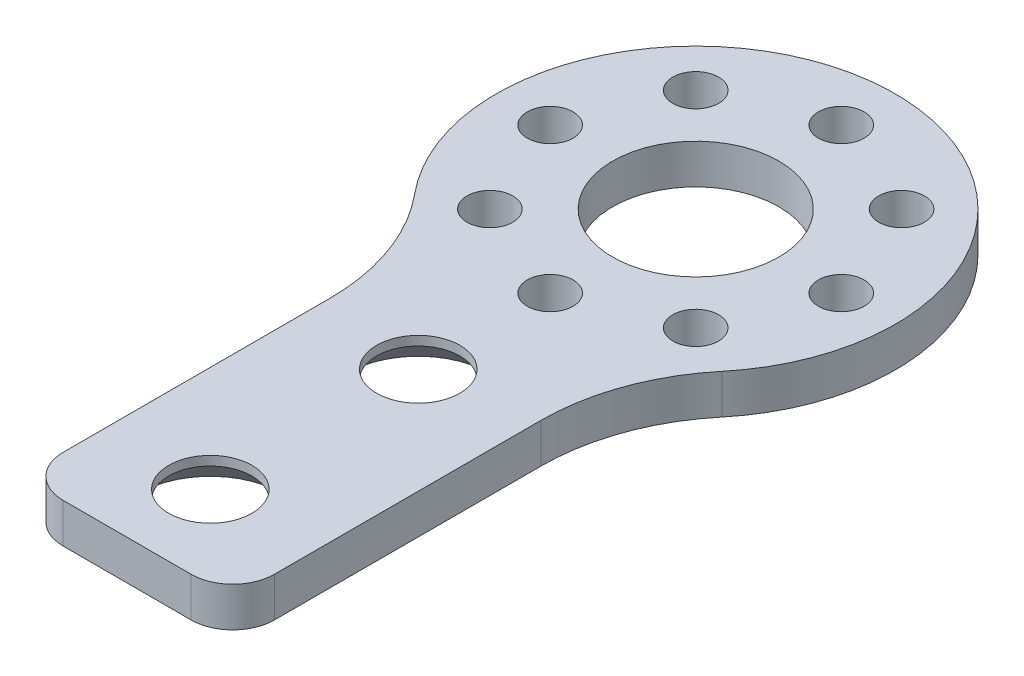
ISO-10303-21;
HEADER;
FILE_DESCRIPTION(('STEP AP214'),'2;1');
FILE_NAME('part.step','',(''),(''),'','','');
FILE_SCHEMA(('AUTOMOTIVE_DESIGN { 1 0 10303 214 1 1 1 1 }'));
ENDSEC;
DATA;
#1=APPLICATION_CONTEXT('core data for automotive mechanical design processes');
#2=APPLICATION_PROTOCOL_DEFINITION('international standard','automotive_design',2000,#1);
#3=PRODUCT_CONTEXT('',#1,'mechanical');
#4=PRODUCT('Part','Part','',(#3));
#5=PRODUCT_RELATED_PRODUCT_CATEGORY('part','',(#4));
#6=PRODUCT_DEFINITION_FORMATION('','',#4);
#7=PRODUCT_DEFINITION_CONTEXT('part definition',#1,'design');
#8=PRODUCT_DEFINITION('design','',#6,#7);
#9=PRODUCT_DEFINITION_SHAPE('','',#8);
#10=(LENGTH_UNIT() NAMED_UNIT(*) SI_UNIT(.MILLI.,.METRE.));
#11=(NAMED_UNIT(*) PLANE_ANGLE_UNIT() SI_UNIT($,.RADIAN.));
#12=(NAMED_UNIT(*) SI_UNIT($,.STERADIAN.) SOLID_ANGLE_UNIT());
#13=UNCERTAINTY_MEASURE_WITH_UNIT(LENGTH_MEASURE(1.E-05),#10,'distance_accuracy_value','');
#14=(GEOMETRIC_REPRESENTATION_CONTEXT(3) GLOBAL_UNCERTAINTY_ASSIGNED_CONTEXT((#13)) GLOBAL_UNIT_ASSIGNED_CONTEXT((#10,
#11,#12)) REPRESENTATION_CONTEXT('',''));
#15=CARTESIAN_POINT('',(0.,0.,0.));
#16=DIRECTION('',(0.,0.,1.));
#17=DIRECTION('',(1.,0.,0.));
#18=AXIS2_PLACEMENT_3D('',#15,#16,#17);
#19=CARTESIAN_POINT('',(0.,0.,0.));
#20=DIRECTION('',(0.,1.,0.));
#21=DIRECTION('',(0.,0.,1.));
#22=AXIS2_PLACEMENT_3D('',#19,#20,#21);
#23=PLANE('',#22);
#24=CARTESIAN_POINT('',(0.,0.,33.3644297735046));
#25=DIRECTION('',(0.,-1.,0.));
#26=DIRECTION('',(0.,0.,-1.));
#27=AXIS2_PLACEMENT_3D('',#24,#25,#26);
#28=CIRCLE('',#27,8.65);
#29=CARTESIAN_POINT('',(0.,0.,24.7144297735046));
#30=VERTEX_POINT('',#29);
#31=EDGE_CURVE('E327',#30,#30,#28,.T.);
#32=ORIENTED_EDGE('',*,*,#31,.F.);
#33=EDGE_LOOP('',(#32));
#34=FACE_BOUND('',#33,.T.);
#35=CARTESIAN_POINT('',(0.,0.,0.));
#36=DIRECTION('',(0.,-1.,0.));
#37=DIRECTION('',(0.,0.,-1.));
#38=AXIS2_PLACEMENT_3D('',#35,#36,#37);
#39=CIRCLE('',#38,10.);
#40=CARTESIAN_POINT('',(0.,0.,-10.));
#41=VERTEX_POINT('',#40);
#42=EDGE_CURVE('E303',#41,#41,#39,.T.);
#43=ORIENTED_EDGE('',*,*,#42,.F.);
#44=EDGE_LOOP('',(#43));
#45=FACE_BOUND('',#44,.T.);
#46=CARTESIAN_POINT('',(0.,0.,-17.5));
#47=DIRECTION('',(0.,-1.,0.));
#48=DIRECTION('',(0.,0.,-1.));
#49=AXIS2_PLACEMENT_3D('',#46,#47,#48);
#50=CIRCLE('',#49,2.775);
#51=CARTESIAN_POINT('',(0.,0.,-20.275));
#52=VERTEX_POINT('',#51);
#53=EDGE_CURVE('E295',#52,#52,#50,.T.);
#54=ORIENTED_EDGE('',*,*,#53,.F.);
#55=EDGE_LOOP('',(#54));
#56=FACE_BOUND('',#55,.T.);
#57=CARTESIAN_POINT('',(-12.3743686707646,0.,-12.3743686707646));
#58=DIRECTION('',(0.,-1.,0.));
#59=DIRECTION('',(0.,0.,-1.));
#60=AXIS2_PLACEMENT_3D('',#57,#58,#59);
#61=CIRCLE('',#60,2.775);
#62=CARTESIAN_POINT('',(-12.3743686707646,0.,-15.1493686707646));
#63=VERTEX_POINT('',#62);
#64=EDGE_CURVE('E283',#63,#63,#61,.T.);
#65=ORIENTED_EDGE('',*,*,#64,.F.);
#66=EDGE_LOOP('',(#65));
#67=FACE_BOUND('',#66,.T.);
#68=CARTESIAN_POINT('',(-17.5,0.,0.));
#69=DIRECTION('',(0.,-1.,0.));
#70=DIRECTION('',(0.,0.,-1.));
#71=AXIS2_PLACEMENT_3D('',#68,#69,#70);
#72=CIRCLE('',#71,2.775);
#73=CARTESIAN_POINT('',(-17.5,0.,-2.775));
#74=VERTEX_POINT('',#73);
#75=EDGE_CURVE('E271',#74,#74,#72,.T.);
#76=ORIENTED_EDGE('',*,*,#75,.F.);
#77=EDGE_LOOP('',(#76));
#78=FACE_BOUND('',#77,.T.);
#79=CARTESIAN_POINT('',(-12.3743686707646,0.,12.3743686707646));
#80=DIRECTION('',(0.,-1.,0.));
#81=DIRECTION('',(0.,0.,-1.));
#82=AXIS2_PLACEMENT_3D('',#79,#80,#81);
#83=CIRCLE('',#82,2.775);
#84=CARTESIAN_POINT('',(-12.3743686707646,0.,9.59936867076458));
#85=VERTEX_POINT('',#84);
#86=EDGE_CURVE('E259',#85,#85,#83,.T.);
#87=ORIENTED_EDGE('',*,*,#86,.F.);
#88=EDGE_LOOP('',(#87));
#89=FACE_BOUND('',#88,.T.);
#90=CARTESIAN_POINT('',(0.,0.,17.5));
#91=DIRECTION('',(0.,-1.,0.));
#92=DIRECTION('',(0.,0.,-1.));
#93=AXIS2_PLACEMENT_3D('',#90,#91,#92);
#94=CIRCLE('',#93,2.775);
#95=CARTESIAN_POINT('',(0.,0.,14.725));
#96=VERTEX_POINT('',#95);
#97=EDGE_CURVE('E247',#96,#96,#94,.T.);
#98=ORIENTED_EDGE('',*,*,#97,.F.);
#99=EDGE_LOOP('',(#98));
#100=FACE_BOUND('',#99,.T.);
#101=CARTESIAN_POINT('',(12.3743686707646,0.,12.3743686707646));
#102=DIRECTION('',(0.,-1.,0.));
#103=DIRECTION('',(0.,0.,-1.));
#104=AXIS2_PLACEMENT_3D('',#101,#102,#103);
#105=CIRCLE('',#104,2.775);
#106=CARTESIAN_POINT('',(12.3743686707646,0.,9.59936867076458));
#107=VERTEX_POINT('',#106);
#108=EDGE_CURVE('E235',#107,#107,#105,.T.);
#109=ORIENTED_EDGE('',*,*,#108,.F.);
#110=EDGE_LOOP('',(#109));
#111=FACE_BOUND('',#110,.T.);
#112=CARTESIAN_POINT('',(17.5,0.,0.));
#113=DIRECTION('',(0.,-1.,0.));
#114=DIRECTION('',(0.,0.,-1.));
#115=AXIS2_PLACEMENT_3D('',#112,#113,#114);
#116=CIRCLE('',#115,2.775);
#117=CARTESIAN_POINT('',(17.5,0.,-2.775));
#118=VERTEX_POINT('',#117);
#119=EDGE_CURVE('E223',#118,#118,#116,.T.);
#120=ORIENTED_EDGE('',*,*,#119,.F.);
#121=EDGE_LOOP('',(#120));
#122=FACE_BOUND('',#121,.T.);
#123=CARTESIAN_POINT('',(12.3743686707646,0.,-12.3743686707646));
#124=DIRECTION('',(0.,-1.,0.));
#125=DIRECTION('',(0.,0.,-1.));
#126=AXIS2_PLACEMENT_3D('',#123,#124,#125);
#127=CIRCLE('',#126,2.775);
#128=CARTESIAN_POINT('',(12.3743686707646,0.,-15.1493686707646));
#129=VERTEX_POINT('',#128);
#130=EDGE_CURVE('E211',#129,#129,#127,.T.);
#131=ORIENTED_EDGE('',*,*,#130,.F.);
#132=EDGE_LOOP('',(#131));
#133=FACE_BOUND('',#132,.T.);
#134=DIRECTION('',(0.,0.,-1.));
#135=VECTOR('',#134,1.);
#136=CARTESIAN_POINT('',(12.7,0.,68.3644297735046));
#137=LINE('',#136,#135);
#138=CARTESIAN_POINT('',(12.7,0.,63.3644297735046));
#139=VERTEX_POINT('',#138);
#140=CARTESIAN_POINT('',(12.7,0.,31.3003194871874));
#141=VERTEX_POINT('',#140);
#142=EDGE_CURVE('E194',#139,#141,#137,.T.);
#143=ORIENTED_EDGE('',*,*,#142,.F.);
#144=CARTESIAN_POINT('',(7.7,0.,63.3644297735046));
#145=DIRECTION('',(0.,1.,0.));
#146=DIRECTION('',(0.,0.,1.));
#147=AXIS2_PLACEMENT_3D('',#144,#145,#146);
#148=CIRCLE('',#147,5.);
#149=CARTESIAN_POINT('',(7.7,0.,68.3644297735046));
#150=VERTEX_POINT('',#149);
#151=EDGE_CURVE('E167',#139,#150,#148,.F.);
#152=ORIENTED_EDGE('',*,*,#151,.T.);
#153=DIRECTION('',(1.,0.,0.));
#154=VECTOR('',#153,1.);
#155=CARTESIAN_POINT('',(-12.7,0.,68.3644297735046));
#156=LINE('',#155,#154);
#157=CARTESIAN_POINT('',(-7.7,0.,68.3644297735046));
#158=VERTEX_POINT('',#157);
#159=EDGE_CURVE('E119',#158,#150,#156,.T.);
#160=ORIENTED_EDGE('',*,*,#159,.F.);
#161=CARTESIAN_POINT('',(-7.7,0.,63.3644297735046));
#162=DIRECTION('',(0.,1.,0.));
#163=DIRECTION('',(0.,0.,1.));
#164=AXIS2_PLACEMENT_3D('',#161,#162,#163);
#165=CIRCLE('',#164,5.);
#166=CARTESIAN_POINT('',(-12.7,0.,63.3644297735046));
#167=VERTEX_POINT('',#166);
#168=EDGE_CURVE('E116',#158,#167,#165,.F.);
#169=ORIENTED_EDGE('',*,*,#168,.T.);
#170=DIRECTION('',(0.,0.,-1.));
#171=VECTOR('',#170,1.);
#172=CARTESIAN_POINT('',(-12.7,0.,68.3644297735046));
#173=LINE('',#172,#171);
#174=CARTESIAN_POINT('',(-12.7,0.,31.3003194871874));
#175=VERTEX_POINT('',#174);
#176=EDGE_CURVE('E108',#167,#175,#173,.T.);
#177=ORIENTED_EDGE('',*,*,#176,.T.);
#178=CARTESIAN_POINT('',(-37.7,0.,31.3003194871874));
#179=DIRECTION('',(0.,1.,0.));
#180=DIRECTION('',(0.,0.,1.));
#181=AXIS2_PLACEMENT_3D('',#178,#179,#180);
#182=CIRCLE('',#181,25.);
#183=CARTESIAN_POINT('',(-18.465306122449,0.,15.3307687284183));
#184=VERTEX_POINT('',#183);
#185=EDGE_CURVE('E113',#175,#184,#182,.T.);
#186=ORIENTED_EDGE('',*,*,#185,.T.);
#187=CARTESIAN_POINT('',(0.,0.,0.));
#188=DIRECTION('',(0.,1.,0.));
#189=DIRECTION('',(0.,0.,1.));
#190=AXIS2_PLACEMENT_3D('',#187,#188,#189);
#191=CIRCLE('',#190,24.);
#192=CARTESIAN_POINT('',(18.465306122449,0.,15.3307687284183));
#193=VERTEX_POINT('',#192);
#194=EDGE_CURVE('E120',#193,#184,#191,.T.);
#195=ORIENTED_EDGE('',*,*,#194,.F.);
#196=CARTESIAN_POINT('',(37.7,0.,31.3003194871874));
#197=DIRECTION('',(0.,1.,0.));
#198=DIRECTION('',(0.,0.,1.));
#199=AXIS2_PLACEMENT_3D('',#196,#197,#198);
#200=CIRCLE('',#199,25.);
#201=EDGE_CURVE('E154',#193,#141,#200,.T.);
#202=ORIENTED_EDGE('',*,*,#201,.T.);
#203=EDGE_LOOP('',(#143,#152,#160,#169,#177,#186,#195,#202));
#204=FACE_BOUND('',#203,.T.);
#205=CARTESIAN_POINT('',(0.,0.,58.3644297735046));
#206=DIRECTION('',(0.,-1.,0.));
#207=DIRECTION('',(0.,0.,-1.));
#208=AXIS2_PLACEMENT_3D('',#205,#206,#207);
#209=CIRCLE('',#208,8.65);
#210=CARTESIAN_POINT('',(0.,0.,49.7144297735046));
#211=VERTEX_POINT('',#210);
#212=EDGE_CURVE('E315',#211,#211,#209,.T.);
#213=ORIENTED_EDGE('',*,*,#212,.F.);
#214=EDGE_LOOP('',(#213));
#215=FACE_BOUND('',#214,.T.);
#216=ADVANCED_FACE('F43',(#34,#45,#56,#67,#78,#89,#100,#111,#122,#133,#204,#215),#23,.F.);
#217=CARTESIAN_POINT('',(12.7,4.7625,68.3644297735046));
#218=DIRECTION('',(-1.,0.,0.));
#219=DIRECTION('',(0.,0.,1.));
#220=AXIS2_PLACEMENT_3D('',#217,#218,#219);
#221=PLANE('',#220);
#222=DIRECTION('',(0.,0.,-1.));
#223=VECTOR('',#222,1.);
#224=CARTESIAN_POINT('',(12.7,4.7625,68.3644297735046));
#225=LINE('',#224,#223);
#226=CARTESIAN_POINT('',(12.7,4.7625,63.3644297735046));
#227=VERTEX_POINT('',#226);
#228=CARTESIAN_POINT('',(12.7,4.7625,31.3003194871874));
#229=VERTEX_POINT('',#228);
#230=EDGE_CURVE('E183',#227,#229,#225,.T.);
#231=ORIENTED_EDGE('',*,*,#230,.F.);
#232=DIRECTION('',(0.,-1.,0.));
#233=VECTOR('',#232,1.);
#234=CARTESIAN_POINT('',(12.7,4.7625,63.3644297735046));
#235=LINE('',#234,#233);
#236=EDGE_CURVE('E161',#227,#139,#235,.T.);
#237=ORIENTED_EDGE('',*,*,#236,.T.);
#238=ORIENTED_EDGE('',*,*,#142,.T.);
#239=DIRECTION('',(0.,1.,0.));
#240=VECTOR('',#239,1.);
#241=CARTESIAN_POINT('',(12.7,4.7625,31.3003194871874));
#242=LINE('',#241,#240);
#243=EDGE_CURVE('E131',#141,#229,#242,.T.);
#244=ORIENTED_EDGE('',*,*,#243,.T.);
#245=EDGE_LOOP('',(#231,#237,#238,#244));
#246=FACE_BOUND('',#245,.T.);
#247=ADVANCED_FACE('F187',(#246),#221,.F.);
#248=CARTESIAN_POINT('',(0.,4.7625,0.));
#249=DIRECTION('',(0.,-1.,0.));
#250=DIRECTION('',(0.,0.,-1.));
#251=AXIS2_PLACEMENT_3D('',#248,#249,#250);
#252=CYLINDRICAL_SURFACE('',#251,24.);
#253=ORIENTED_EDGE('',*,*,#194,.T.);
#254=DIRECTION('',(0.,-1.,0.));
#255=VECTOR('',#254,1.);
#256=CARTESIAN_POINT('',(-18.465306122449,4.7625,15.3307687284183));
#257=LINE('',#256,#255);
#258=CARTESIAN_POINT('',(-18.465306122449,4.7625,15.3307687284183));
#259=VERTEX_POINT('',#258);
#260=EDGE_CURVE('E128',#184,#259,#257,.F.);
#261=ORIENTED_EDGE('',*,*,#260,.T.);
#262=CARTESIAN_POINT('',(0.,4.7625,0.));
#263=DIRECTION('',(0.,1.,0.));
#264=DIRECTION('',(0.,0.,1.));
#265=AXIS2_PLACEMENT_3D('',#262,#263,#264);
#266=CIRCLE('',#265,24.);
#267=CARTESIAN_POINT('',(18.465306122449,4.7625,15.3307687284183));
#268=VERTEX_POINT('',#267);
#269=EDGE_CURVE('E191',#268,#259,#266,.T.);
#270=ORIENTED_EDGE('',*,*,#269,.F.);
#271=DIRECTION('',(0.,-1.,0.));
#272=VECTOR('',#271,1.);
#273=CARTESIAN_POINT('',(18.465306122449,4.7625,15.3307687284183));
#274=LINE('',#273,#272);
#275=EDGE_CURVE('E137',#268,#193,#274,.T.);
#276=ORIENTED_EDGE('',*,*,#275,.T.);
#277=EDGE_LOOP('',(#253,#261,#270,#276));
#278=FACE_BOUND('',#277,.T.);
#279=ADVANCED_FACE('F340',(#278),#252,.T.);
#280=CARTESIAN_POINT('',(-12.7,4.7625,68.3644297735046));
#281=DIRECTION('',(-1.,0.,0.));
#282=DIRECTION('',(0.,0.,1.));
#283=AXIS2_PLACEMENT_3D('',#280,#281,#282);
#284=PLANE('',#283);
#285=ORIENTED_EDGE('',*,*,#176,.F.);
#286=DIRECTION('',(0.,-1.,0.));
#287=VECTOR('',#286,1.);
#288=CARTESIAN_POINT('',(-12.7,4.7625,63.3644297735046));
#289=LINE('',#288,#287);
#290=CARTESIAN_POINT('',(-12.7,4.7625,63.3644297735046));
#291=VERTEX_POINT('',#290);
#292=EDGE_CURVE('E11',#167,#291,#289,.F.);
#293=ORIENTED_EDGE('',*,*,#292,.T.);
#294=DIRECTION('',(0.,0.,-1.));
#295=VECTOR('',#294,1.);
#296=CARTESIAN_POINT('',(-12.7,4.7625,68.3644297735046));
#297=LINE('',#296,#295);
#298=CARTESIAN_POINT('',(-12.7,4.7625,31.3003194871874));
#299=VERTEX_POINT('',#298);
#300=EDGE_CURVE('E134',#291,#299,#297,.T.);
#301=ORIENTED_EDGE('',*,*,#300,.T.);
#302=DIRECTION('',(0.,-1.,0.));
#303=VECTOR('',#302,1.);
#304=CARTESIAN_POINT('',(-12.7,4.7625,31.3003194871874));
#305=LINE('',#304,#303);
#306=EDGE_CURVE('E127',#299,#175,#305,.T.);
#307=ORIENTED_EDGE('',*,*,#306,.T.);
#308=EDGE_LOOP('',(#285,#293,#301,#307));
#309=FACE_BOUND('',#308,.T.);
#310=ADVANCED_FACE('F133',(#309),#284,.T.);
#311=CARTESIAN_POINT('',(-12.7,4.7625,68.3644297735046));
#312=DIRECTION('',(0.,0.,-1.));
#313=DIRECTION('',(-1.,0.,0.));
#314=AXIS2_PLACEMENT_3D('',#311,#312,#313);
#315=PLANE('',#314);
#316=ORIENTED_EDGE('',*,*,#159,.T.);
#317=DIRECTION('',(0.,-1.,0.));
#318=VECTOR('',#317,1.);
#319=CARTESIAN_POINT('',(7.7,4.7625,68.3644297735046));
#320=LINE('',#319,#318);
#321=CARTESIAN_POINT('',(7.7,4.7625,68.3644297735046));
#322=VERTEX_POINT('',#321);
#323=EDGE_CURVE('E65',#150,#322,#320,.F.);
#324=ORIENTED_EDGE('',*,*,#323,.T.);
#325=DIRECTION('',(1.,0.,0.));
#326=VECTOR('',#325,1.);
#327=CARTESIAN_POINT('',(-12.7,4.7625,68.3644297735046));
#328=LINE('',#327,#326);
#329=CARTESIAN_POINT('',(-7.7,4.7625,68.3644297735046));
#330=VERTEX_POINT('',#329);
#331=EDGE_CURVE('E138',#330,#322,#328,.T.);
#332=ORIENTED_EDGE('',*,*,#331,.F.);
#333=DIRECTION('',(0.,-1.,0.));
#334=VECTOR('',#333,1.);
#335=CARTESIAN_POINT('',(-7.7,0.,68.3644297735046));
#336=LINE('',#335,#334);
#337=EDGE_CURVE('E170',#330,#158,#336,.T.);
#338=ORIENTED_EDGE('',*,*,#337,.T.);
#339=EDGE_LOOP('',(#316,#324,#332,#338));
#340=FACE_BOUND('',#339,.T.);
#341=ADVANCED_FACE('F195',(#340),#315,.F.);
#342=CARTESIAN_POINT('',(0.,4.7625,0.));
#343=DIRECTION('',(0.,1.,0.));
#344=DIRECTION('',(0.,0.,1.));
#345=AXIS2_PLACEMENT_3D('',#342,#343,#344);
#346=PLANE('',#345);
#347=CARTESIAN_POINT('',(0.,4.7625,33.3644297735046));
#348=DIRECTION('',(0.,-1.,0.));
#349=DIRECTION('',(0.,0.,-1.));
#350=AXIS2_PLACEMENT_3D('',#347,#348,#349);
#351=CIRCLE('',#350,5.);
#352=CARTESIAN_POINT('',(0.,4.7625,28.3644297735046));
#353=VERTEX_POINT('',#352);
#354=EDGE_CURVE('E319',#353,#353,#351,.T.);
#355=ORIENTED_EDGE('',*,*,#354,.T.);
#356=EDGE_LOOP('',(#355));
#357=FACE_BOUND('',#356,.T.);
#358=CARTESIAN_POINT('',(0.,4.7625,58.3644297735046));
#359=DIRECTION('',(0.,-1.,0.));
#360=DIRECTION('',(0.,0.,-1.));
#361=AXIS2_PLACEMENT_3D('',#358,#359,#360);
#362=CIRCLE('',#361,5.);
#363=CARTESIAN_POINT('',(0.,4.7625,53.3644297735046));
#364=VERTEX_POINT('',#363);
#365=EDGE_CURVE('E307',#364,#364,#362,.T.);
#366=ORIENTED_EDGE('',*,*,#365,.T.);
#367=EDGE_LOOP('',(#366));
#368=FACE_BOUND('',#367,.T.);
#369=CARTESIAN_POINT('',(0.,4.7625,0.));
#370=DIRECTION('',(0.,-1.,0.));
#371=DIRECTION('',(0.,0.,-1.));
#372=AXIS2_PLACEMENT_3D('',#369,#370,#371);
#373=CIRCLE('',#372,10.);
#374=CARTESIAN_POINT('',(0.,4.7625,-10.));
#375=VERTEX_POINT('',#374);
#376=EDGE_CURVE('E299',#375,#375,#373,.T.);
#377=ORIENTED_EDGE('',*,*,#376,.T.);
#378=EDGE_LOOP('',(#377));
#379=FACE_BOUND('',#378,.T.);
#380=CARTESIAN_POINT('',(0.,4.7625,-17.5));
#381=DIRECTION('',(0.,-1.,0.));
#382=DIRECTION('',(0.,0.,-1.));
#383=AXIS2_PLACEMENT_3D('',#380,#381,#382);
#384=CIRCLE('',#383,2.75);
#385=CARTESIAN_POINT('',(0.,4.7625,-20.25));
#386=VERTEX_POINT('',#385);
#387=EDGE_CURVE('E287',#386,#386,#384,.T.);
#388=ORIENTED_EDGE('',*,*,#387,.T.);
#389=EDGE_LOOP('',(#388));
#390=FACE_BOUND('',#389,.T.);
#391=CARTESIAN_POINT('',(-12.3743686707646,4.7625,-12.3743686707646));
#392=DIRECTION('',(0.,-1.,0.));
#393=DIRECTION('',(0.,0.,-1.));
#394=AXIS2_PLACEMENT_3D('',#391,#392,#393);
#395=CIRCLE('',#394,2.75);
#396=CARTESIAN_POINT('',(-12.3743686707646,4.7625,-15.1243686707646));
#397=VERTEX_POINT('',#396);
#398=EDGE_CURVE('E275',#397,#397,#395,.T.);
#399=ORIENTED_EDGE('',*,*,#398,.T.);
#400=EDGE_LOOP('',(#399));
#401=FACE_BOUND('',#400,.T.);
#402=CARTESIAN_POINT('',(-17.5,4.7625,0.));
#403=DIRECTION('',(0.,-1.,0.));
#404=DIRECTION('',(0.,0.,-1.));
#405=AXIS2_PLACEMENT_3D('',#402,#403,#404);
#406=CIRCLE('',#405,2.75);
#407=CARTESIAN_POINT('',(-17.5,4.7625,-2.75));
#408=VERTEX_POINT('',#407);
#409=EDGE_CURVE('E263',#408,#408,#406,.T.);
#410=ORIENTED_EDGE('',*,*,#409,.T.);
#411=EDGE_LOOP('',(#410));
#412=FACE_BOUND('',#411,.T.);
#413=CARTESIAN_POINT('',(-12.3743686707646,4.7625,12.3743686707646));
#414=DIRECTION('',(0.,-1.,0.));
#415=DIRECTION('',(0.,0.,-1.));
#416=AXIS2_PLACEMENT_3D('',#413,#414,#415);
#417=CIRCLE('',#416,2.75);
#418=CARTESIAN_POINT('',(-12.3743686707646,4.7625,9.62436867076458));
#419=VERTEX_POINT('',#418);
#420=EDGE_CURVE('E251',#419,#419,#417,.T.);
#421=ORIENTED_EDGE('',*,*,#420,.T.);
#422=EDGE_LOOP('',(#421));
#423=FACE_BOUND('',#422,.T.);
#424=CARTESIAN_POINT('',(0.,4.7625,17.5));
#425=DIRECTION('',(0.,-1.,0.));
#426=DIRECTION('',(0.,0.,-1.));
#427=AXIS2_PLACEMENT_3D('',#424,#425,#426);
#428=CIRCLE('',#427,2.75);
#429=CARTESIAN_POINT('',(0.,4.7625,14.75));
#430=VERTEX_POINT('',#429);
#431=EDGE_CURVE('E239',#430,#430,#428,.T.);
#432=ORIENTED_EDGE('',*,*,#431,.T.);
#433=EDGE_LOOP('',(#432));
#434=FACE_BOUND('',#433,.T.);
#435=CARTESIAN_POINT('',(12.3743686707646,4.7625,12.3743686707646));
#436=DIRECTION('',(0.,-1.,0.));
#437=DIRECTION('',(0.,0.,-1.));
#438=AXIS2_PLACEMENT_3D('',#435,#436,#437);
#439=CIRCLE('',#438,2.75);
#440=CARTESIAN_POINT('',(12.3743686707646,4.7625,9.62436867076458));
#441=VERTEX_POINT('',#440);
#442=EDGE_CURVE('E227',#441,#441,#439,.T.);
#443=ORIENTED_EDGE('',*,*,#442,.T.);
#444=EDGE_LOOP('',(#443));
#445=FACE_BOUND('',#444,.T.);
#446=CARTESIAN_POINT('',(17.5,4.7625,0.));
#447=DIRECTION('',(0.,-1.,0.));
#448=DIRECTION('',(0.,0.,-1.));
#449=AXIS2_PLACEMENT_3D('',#446,#447,#448);
#450=CIRCLE('',#449,2.75);
#451=CARTESIAN_POINT('',(17.5,4.7625,-2.75));
#452=VERTEX_POINT('',#451);
#453=EDGE_CURVE('E215',#452,#452,#450,.T.);
#454=ORIENTED_EDGE('',*,*,#453,.T.);
#455=EDGE_LOOP('',(#454));
#456=FACE_BOUND('',#455,.T.);
#457=CARTESIAN_POINT('',(12.3743686707646,4.7625,-12.3743686707646));
#458=DIRECTION('',(0.,-1.,0.));
#459=DIRECTION('',(0.,0.,-1.));
#460=AXIS2_PLACEMENT_3D('',#457,#458,#459);
#461=CIRCLE('',#460,2.75);
#462=CARTESIAN_POINT('',(12.3743686707646,4.7625,-15.1243686707646));
#463=VERTEX_POINT('',#462);
#464=EDGE_CURVE('E203',#463,#463,#461,.T.);
#465=ORIENTED_EDGE('',*,*,#464,.T.);
#466=EDGE_LOOP('',(#465));
#467=FACE_BOUND('',#466,.T.);
#468=ORIENTED_EDGE('',*,*,#331,.T.);
#469=CARTESIAN_POINT('',(7.7,4.7625,63.3644297735046));
#470=DIRECTION('',(0.,1.,0.));
#471=DIRECTION('',(0.,0.,1.));
#472=AXIS2_PLACEMENT_3D('',#469,#470,#471);
#473=CIRCLE('',#472,5.);
#474=EDGE_CURVE('E52',#322,#227,#473,.T.);
#475=ORIENTED_EDGE('',*,*,#474,.T.);
#476=ORIENTED_EDGE('',*,*,#230,.T.);
#477=CARTESIAN_POINT('',(37.7,4.7625,31.3003194871874));
#478=DIRECTION('',(0.,1.,0.));
#479=DIRECTION('',(0.,0.,1.));
#480=AXIS2_PLACEMENT_3D('',#477,#478,#479);
#481=CIRCLE('',#480,25.);
#482=EDGE_CURVE('E158',#229,#268,#481,.F.);
#483=ORIENTED_EDGE('',*,*,#482,.T.);
#484=ORIENTED_EDGE('',*,*,#269,.T.);
#485=CARTESIAN_POINT('',(-37.7,4.7625,31.3003194871874));
#486=DIRECTION('',(0.,1.,0.));
#487=DIRECTION('',(0.,0.,1.));
#488=AXIS2_PLACEMENT_3D('',#485,#486,#487);
#489=CIRCLE('',#488,25.);
#490=EDGE_CURVE('E130',#259,#299,#489,.F.);
#491=ORIENTED_EDGE('',*,*,#490,.T.);
#492=ORIENTED_EDGE('',*,*,#300,.F.);
#493=CARTESIAN_POINT('',(-7.7,4.7625,63.3644297735046));
#494=DIRECTION('',(0.,1.,0.));
#495=DIRECTION('',(0.,0.,1.));
#496=AXIS2_PLACEMENT_3D('',#493,#494,#495);
#497=CIRCLE('',#496,5.);
#498=EDGE_CURVE('E176',#291,#330,#497,.T.);
#499=ORIENTED_EDGE('',*,*,#498,.T.);
#500=EDGE_LOOP('',(#468,#475,#476,#483,#484,#491,#492,#499));
#501=FACE_BOUND('',#500,.T.);
#502=ADVANCED_FACE('F182',(#357,#368,#379,#390,#401,#412,#423,#434,#445,#456,#467,#501),#346,.T.);
#503=CARTESIAN_POINT('',(12.3743686707646,0.,-12.3743686707646));
#504=DIRECTION('',(0.,-1.,0.));
#505=DIRECTION('',(0.,0.,-1.));
#506=AXIS2_PLACEMENT_3D('',#503,#504,#505);
#507=CYLINDRICAL_SURFACE('',#506,2.75);
#508=ORIENTED_EDGE('',*,*,#464,.F.);
#509=EDGE_LOOP('',(#508));
#510=FACE_BOUND('',#509,.T.);
#511=CARTESIAN_POINT('',(12.3743686707646,0.0249999999999998,-12.3743686707646));
#512=DIRECTION('',(0.,-1.,0.));
#513=DIRECTION('',(0.,0.,-1.));
#514=AXIS2_PLACEMENT_3D('',#511,#512,#513);
#515=CIRCLE('',#514,2.75);
#516=CARTESIAN_POINT('',(12.3743686707646,0.0249999999999998,-15.1243686707646));
#517=VERTEX_POINT('',#516);
#518=EDGE_CURVE('E207',#517,#517,#515,.T.);
#519=ORIENTED_EDGE('',*,*,#518,.T.);
#520=EDGE_LOOP('',(#519));
#521=FACE_BOUND('',#520,.T.);
#522=ADVANCED_FACE('F387',(#510,#521),#507,.F.);
#523=CARTESIAN_POINT('',(12.3743686707646,0.,-12.3743686707646));
#524=DIRECTION('',(0.,-1.,0.));
#525=DIRECTION('',(0.,0.,-1.));
#526=AXIS2_PLACEMENT_3D('',#523,#524,#525);
#527=CONICAL_SURFACE('',#526,2.775,0.785398163397431);
#528=ORIENTED_EDGE('',*,*,#518,.F.);
#529=EDGE_LOOP('',(#528));
#530=FACE_BOUND('',#529,.T.);
#531=ORIENTED_EDGE('',*,*,#130,.T.);
#532=EDGE_LOOP('',(#531));
#533=FACE_BOUND('',#532,.T.);
#534=ADVANCED_FACE('F395',(#530,#533),#527,.F.);
#535=CARTESIAN_POINT('',(17.5,0.,0.));
#536=DIRECTION('',(0.,-1.,0.));
#537=DIRECTION('',(0.,0.,-1.));
#538=AXIS2_PLACEMENT_3D('',#535,#536,#537);
#539=CYLINDRICAL_SURFACE('',#538,2.75);
#540=ORIENTED_EDGE('',*,*,#453,.F.);
#541=EDGE_LOOP('',(#540));
#542=FACE_BOUND('',#541,.T.);
#543=CARTESIAN_POINT('',(17.5,0.0249999999999998,0.));
#544=DIRECTION('',(0.,-1.,0.));
#545=DIRECTION('',(0.,0.,-1.));
#546=AXIS2_PLACEMENT_3D('',#543,#544,#545);
#547=CIRCLE('',#546,2.75);
#548=CARTESIAN_POINT('',(17.5,0.0249999999999998,-2.75));
#549=VERTEX_POINT('',#548);
#550=EDGE_CURVE('E219',#549,#549,#547,.T.);
#551=ORIENTED_EDGE('',*,*,#550,.T.);
#552=EDGE_LOOP('',(#551));
#553=FACE_BOUND('',#552,.T.);
#554=ADVANCED_FACE('F402',(#542,#553),#539,.F.);
#555=CARTESIAN_POINT('',(17.5,0.,0.));
#556=DIRECTION('',(0.,-1.,0.));
#557=DIRECTION('',(0.,0.,-1.));
#558=AXIS2_PLACEMENT_3D('',#555,#556,#557);
#559=CONICAL_SURFACE('',#558,2.775,0.785398163397466);
#560=ORIENTED_EDGE('',*,*,#550,.F.);
#561=EDGE_LOOP('',(#560));
#562=FACE_BOUND('',#561,.T.);
#563=ORIENTED_EDGE('',*,*,#119,.T.);
#564=EDGE_LOOP('',(#563));
#565=FACE_BOUND('',#564,.T.);
#566=ADVANCED_FACE('F410',(#562,#565),#559,.F.);
#567=CARTESIAN_POINT('',(12.3743686707646,0.,12.3743686707646));
#568=DIRECTION('',(0.,-1.,0.));
#569=DIRECTION('',(0.,0.,-1.));
#570=AXIS2_PLACEMENT_3D('',#567,#568,#569);
#571=CYLINDRICAL_SURFACE('',#570,2.75);
#572=ORIENTED_EDGE('',*,*,#442,.F.);
#573=EDGE_LOOP('',(#572));
#574=FACE_BOUND('',#573,.T.);
#575=CARTESIAN_POINT('',(12.3743686707646,0.0249999999999998,12.3743686707646));
#576=DIRECTION('',(0.,-1.,0.));
#577=DIRECTION('',(0.,0.,-1.));
#578=AXIS2_PLACEMENT_3D('',#575,#576,#577);
#579=CIRCLE('',#578,2.75);
#580=CARTESIAN_POINT('',(12.3743686707646,0.0249999999999998,9.62436867076458));
#581=VERTEX_POINT('',#580);
#582=EDGE_CURVE('E231',#581,#581,#579,.T.);
#583=ORIENTED_EDGE('',*,*,#582,.T.);
#584=EDGE_LOOP('',(#583));
#585=FACE_BOUND('',#584,.T.);
#586=ADVANCED_FACE('F418',(#574,#585),#571,.F.);
#587=CARTESIAN_POINT('',(12.3743686707646,0.,12.3743686707646));
#588=DIRECTION('',(0.,-1.,0.));
#589=DIRECTION('',(0.,0.,-1.));
#590=AXIS2_PLACEMENT_3D('',#587,#588,#589);
#591=CONICAL_SURFACE('',#590,2.775,0.785398163397431);
#592=ORIENTED_EDGE('',*,*,#582,.F.);
#593=EDGE_LOOP('',(#592));
#594=FACE_BOUND('',#593,.T.);
#595=ORIENTED_EDGE('',*,*,#108,.T.);
#596=EDGE_LOOP('',(#595));
#597=FACE_BOUND('',#596,.T.);
#598=ADVANCED_FACE('F426',(#594,#597),#591,.F.);
#599=CARTESIAN_POINT('',(0.,0.,17.5));
#600=DIRECTION('',(0.,-1.,0.));
#601=DIRECTION('',(0.,0.,-1.));
#602=AXIS2_PLACEMENT_3D('',#599,#600,#601);
#603=CYLINDRICAL_SURFACE('',#602,2.75);
#604=ORIENTED_EDGE('',*,*,#431,.F.);
#605=EDGE_LOOP('',(#604));
#606=FACE_BOUND('',#605,.T.);
#607=CARTESIAN_POINT('',(0.,0.0249999999999998,17.5));
#608=DIRECTION('',(0.,-1.,0.));
#609=DIRECTION('',(0.,0.,-1.));
#610=AXIS2_PLACEMENT_3D('',#607,#608,#609);
#611=CIRCLE('',#610,2.75);
#612=CARTESIAN_POINT('',(0.,0.0249999999999998,14.75));
#613=VERTEX_POINT('',#612);
#614=EDGE_CURVE('E243',#613,#613,#611,.T.);
#615=ORIENTED_EDGE('',*,*,#614,.T.);
#616=EDGE_LOOP('',(#615));
#617=FACE_BOUND('',#616,.T.);
#618=ADVANCED_FACE('F434',(#606,#617),#603,.F.);
#619=CARTESIAN_POINT('',(0.,0.,17.5));
#620=DIRECTION('',(0.,-1.,0.));
#621=DIRECTION('',(0.,0.,-1.));
#622=AXIS2_PLACEMENT_3D('',#619,#620,#621);
#623=CONICAL_SURFACE('',#622,2.775,0.785398163397457);
#624=ORIENTED_EDGE('',*,*,#614,.F.);
#625=EDGE_LOOP('',(#624));
#626=FACE_BOUND('',#625,.T.);
#627=ORIENTED_EDGE('',*,*,#97,.T.);
#628=EDGE_LOOP('',(#627));
#629=FACE_BOUND('',#628,.T.);
#630=ADVANCED_FACE('F442',(#626,#629),#623,.F.);
#631=CARTESIAN_POINT('',(-12.3743686707646,0.,12.3743686707646));
#632=DIRECTION('',(0.,-1.,0.));
#633=DIRECTION('',(0.,0.,-1.));
#634=AXIS2_PLACEMENT_3D('',#631,#632,#633);
#635=CYLINDRICAL_SURFACE('',#634,2.75);
#636=ORIENTED_EDGE('',*,*,#420,.F.);
#637=EDGE_LOOP('',(#636));
#638=FACE_BOUND('',#637,.T.);
#639=CARTESIAN_POINT('',(-12.3743686707646,0.0249999999999998,12.3743686707646));
#640=DIRECTION('',(0.,-1.,0.));
#641=DIRECTION('',(0.,0.,-1.));
#642=AXIS2_PLACEMENT_3D('',#639,#640,#641);
#643=CIRCLE('',#642,2.75);
#644=CARTESIAN_POINT('',(-12.3743686707646,0.0249999999999998,9.62436867076458));
#645=VERTEX_POINT('',#644);
#646=EDGE_CURVE('E255',#645,#645,#643,.T.);
#647=ORIENTED_EDGE('',*,*,#646,.T.);
#648=EDGE_LOOP('',(#647));
#649=FACE_BOUND('',#648,.T.);
#650=ADVANCED_FACE('F450',(#638,#649),#635,.F.);
#651=CARTESIAN_POINT('',(-12.3743686707646,0.,12.3743686707646));
#652=DIRECTION('',(0.,-1.,0.));
#653=DIRECTION('',(0.,0.,-1.));
#654=AXIS2_PLACEMENT_3D('',#651,#652,#653);
#655=CONICAL_SURFACE('',#654,2.775,0.785398163397466);
#656=ORIENTED_EDGE('',*,*,#646,.F.);
#657=EDGE_LOOP('',(#656));
#658=FACE_BOUND('',#657,.T.);
#659=ORIENTED_EDGE('',*,*,#86,.T.);
#660=EDGE_LOOP('',(#659));
#661=FACE_BOUND('',#660,.T.);
#662=ADVANCED_FACE('F458',(#658,#661),#655,.F.);
#663=CARTESIAN_POINT('',(-17.5,0.,0.));
#664=DIRECTION('',(0.,-1.,0.));
#665=DIRECTION('',(0.,0.,-1.));
#666=AXIS2_PLACEMENT_3D('',#663,#664,#665);
#667=CYLINDRICAL_SURFACE('',#666,2.75);
#668=ORIENTED_EDGE('',*,*,#409,.F.);
#669=EDGE_LOOP('',(#668));
#670=FACE_BOUND('',#669,.T.);
#671=CARTESIAN_POINT('',(-17.5,0.0249999999999998,0.));
#672=DIRECTION('',(0.,-1.,0.));
#673=DIRECTION('',(0.,0.,-1.));
#674=AXIS2_PLACEMENT_3D('',#671,#672,#673);
#675=CIRCLE('',#674,2.75);
#676=CARTESIAN_POINT('',(-17.5,0.0249999999999998,-2.75));
#677=VERTEX_POINT('',#676);
#678=EDGE_CURVE('E267',#677,#677,#675,.T.);
#679=ORIENTED_EDGE('',*,*,#678,.T.);
#680=EDGE_LOOP('',(#679));
#681=FACE_BOUND('',#680,.T.);
#682=ADVANCED_FACE('F466',(#670,#681),#667,.F.);
#683=CARTESIAN_POINT('',(-17.5,0.,0.));
#684=DIRECTION('',(0.,-1.,0.));
#685=DIRECTION('',(0.,0.,-1.));
#686=AXIS2_PLACEMENT_3D('',#683,#684,#685);
#687=CONICAL_SURFACE('',#686,2.775,0.785398163397466);
#688=ORIENTED_EDGE('',*,*,#678,.F.);
#689=EDGE_LOOP('',(#688));
#690=FACE_BOUND('',#689,.T.);
#691=ORIENTED_EDGE('',*,*,#75,.T.);
#692=EDGE_LOOP('',(#691));
#693=FACE_BOUND('',#692,.T.);
#694=ADVANCED_FACE('F474',(#690,#693),#687,.F.);
#695=CARTESIAN_POINT('',(-12.3743686707646,0.,-12.3743686707646));
#696=DIRECTION('',(0.,-1.,0.));
#697=DIRECTION('',(0.,0.,-1.));
#698=AXIS2_PLACEMENT_3D('',#695,#696,#697);
#699=CYLINDRICAL_SURFACE('',#698,2.75);
#700=ORIENTED_EDGE('',*,*,#398,.F.);
#701=EDGE_LOOP('',(#700));
#702=FACE_BOUND('',#701,.T.);
#703=CARTESIAN_POINT('',(-12.3743686707646,0.0249999999999998,-12.3743686707646));
#704=DIRECTION('',(0.,-1.,0.));
#705=DIRECTION('',(0.,0.,-1.));
#706=AXIS2_PLACEMENT_3D('',#703,#704,#705);
#707=CIRCLE('',#706,2.75);
#708=CARTESIAN_POINT('',(-12.3743686707646,0.0249999999999998,-15.1243686707646));
#709=VERTEX_POINT('',#708);
#710=EDGE_CURVE('E279',#709,#709,#707,.T.);
#711=ORIENTED_EDGE('',*,*,#710,.T.);
#712=EDGE_LOOP('',(#711));
#713=FACE_BOUND('',#712,.T.);
#714=ADVANCED_FACE('F482',(#702,#713),#699,.F.);
#715=CARTESIAN_POINT('',(-12.3743686707646,0.,-12.3743686707646));
#716=DIRECTION('',(0.,-1.,0.));
#717=DIRECTION('',(0.,0.,-1.));
#718=AXIS2_PLACEMENT_3D('',#715,#716,#717);
#719=CONICAL_SURFACE('',#718,2.775,0.785398163397431);
#720=ORIENTED_EDGE('',*,*,#710,.F.);
#721=EDGE_LOOP('',(#720));
#722=FACE_BOUND('',#721,.T.);
#723=ORIENTED_EDGE('',*,*,#64,.T.);
#724=EDGE_LOOP('',(#723));
#725=FACE_BOUND('',#724,.T.);
#726=ADVANCED_FACE('F490',(#722,#725),#719,.F.);
#727=CARTESIAN_POINT('',(0.,0.,-17.5));
#728=DIRECTION('',(0.,-1.,0.));
#729=DIRECTION('',(0.,0.,-1.));
#730=AXIS2_PLACEMENT_3D('',#727,#728,#729);
#731=CYLINDRICAL_SURFACE('',#730,2.75);
#732=ORIENTED_EDGE('',*,*,#387,.F.);
#733=EDGE_LOOP('',(#732));
#734=FACE_BOUND('',#733,.T.);
#735=CARTESIAN_POINT('',(0.,0.0249999999999998,-17.5));
#736=DIRECTION('',(0.,-1.,0.));
#737=DIRECTION('',(0.,0.,-1.));
#738=AXIS2_PLACEMENT_3D('',#735,#736,#737);
#739=CIRCLE('',#738,2.75);
#740=CARTESIAN_POINT('',(0.,0.0249999999999998,-20.25));
#741=VERTEX_POINT('',#740);
#742=EDGE_CURVE('E291',#741,#741,#739,.T.);
#743=ORIENTED_EDGE('',*,*,#742,.T.);
#744=EDGE_LOOP('',(#743));
#745=FACE_BOUND('',#744,.T.);
#746=ADVANCED_FACE('F498',(#734,#745),#731,.F.);
#747=CARTESIAN_POINT('',(0.,0.,-17.5));
#748=DIRECTION('',(0.,-1.,0.));
#749=DIRECTION('',(0.,0.,-1.));
#750=AXIS2_PLACEMENT_3D('',#747,#748,#749);
#751=CONICAL_SURFACE('',#750,2.775,0.785398163397457);
#752=ORIENTED_EDGE('',*,*,#742,.F.);
#753=EDGE_LOOP('',(#752));
#754=FACE_BOUND('',#753,.T.);
#755=ORIENTED_EDGE('',*,*,#53,.T.);
#756=EDGE_LOOP('',(#755));
#757=FACE_BOUND('',#756,.T.);
#758=ADVANCED_FACE('F506',(#754,#757),#751,.F.);
#759=CARTESIAN_POINT('',(0.,4.7625,0.));
#760=DIRECTION('',(0.,-1.,0.));
#761=DIRECTION('',(0.,0.,-1.));
#762=AXIS2_PLACEMENT_3D('',#759,#760,#761);
#763=CYLINDRICAL_SURFACE('',#762,10.);
#764=CARTESIAN_POINT('',(0.,4.7625,-10.));
#765=CARTESIAN_POINT('',(0.,4.712890625,-10.));
#766=CARTESIAN_POINT('',(0.,4.66328125,-10.));
#767=CARTESIAN_POINT('',(0.,4.5640625,-10.));
#768=CARTESIAN_POINT('',(0.,4.514453125,-10.));
#769=CARTESIAN_POINT('',(0.,4.415234375,-10.));
#770=CARTESIAN_POINT('',(0.,4.365625,-10.));
#771=CARTESIAN_POINT('',(0.,4.26640625,-10.));
#772=CARTESIAN_POINT('',(0.,4.216796875,-10.));
#773=CARTESIAN_POINT('',(0.,4.117578125,-10.));
#774=CARTESIAN_POINT('',(0.,4.06796875,-10.));
#775=CARTESIAN_POINT('',(0.,3.96875,-10.));
#776=CARTESIAN_POINT('',(0.,3.919140625,-10.));
#777=CARTESIAN_POINT('',(0.,3.819921875,-10.));
#778=CARTESIAN_POINT('',(0.,3.7703125,-10.));
#779=CARTESIAN_POINT('',(0.,3.67109375,-10.));
#780=CARTESIAN_POINT('',(0.,3.621484375,-10.));
#781=CARTESIAN_POINT('',(0.,3.522265625,-10.));
#782=CARTESIAN_POINT('',(0.,3.47265625,-10.));
#783=CARTESIAN_POINT('',(0.,3.3734375,-10.));
#784=CARTESIAN_POINT('',(0.,3.323828125,-10.));
#785=CARTESIAN_POINT('',(0.,3.224609375,-10.));
#786=CARTESIAN_POINT('',(0.,3.175,-10.));
#787=CARTESIAN_POINT('',(0.,3.07578125,-10.));
#788=CARTESIAN_POINT('',(0.,3.026171875,-10.));
#789=CARTESIAN_POINT('',(0.,2.926953125,-10.));
#790=CARTESIAN_POINT('',(0.,2.87734375,-10.));
#791=CARTESIAN_POINT('',(0.,2.778125,-10.));
#792=CARTESIAN_POINT('',(0.,2.728515625,-10.));
#793=CARTESIAN_POINT('',(0.,2.629296875,-10.));
#794=CARTESIAN_POINT('',(0.,2.5796875,-10.));
#795=CARTESIAN_POINT('',(0.,2.48046875,-10.));
#796=CARTESIAN_POINT('',(0.,2.430859375,-10.));
#797=CARTESIAN_POINT('',(0.,2.331640625,-10.));
#798=CARTESIAN_POINT('',(0.,2.28203125,-10.));
#799=CARTESIAN_POINT('',(0.,2.1828125,-10.));
#800=CARTESIAN_POINT('',(0.,2.133203125,-10.));
#801=CARTESIAN_POINT('',(0.,2.033984375,-10.));
#802=CARTESIAN_POINT('',(0.,1.984375,-10.));
#803=CARTESIAN_POINT('',(0.,1.88515625,-10.));
#804=CARTESIAN_POINT('',(0.,1.835546875,-10.));
#805=CARTESIAN_POINT('',(0.,1.736328125,-10.));
#806=CARTESIAN_POINT('',(0.,1.68671875,-10.));
#807=CARTESIAN_POINT('',(0.,1.5875,-10.));
#808=CARTESIAN_POINT('',(0.,1.537890625,-10.));
#809=CARTESIAN_POINT('',(0.,1.438671875,-10.));
#810=CARTESIAN_POINT('',(0.,1.3890625,-10.));
#811=CARTESIAN_POINT('',(0.,1.28984375,-10.));
#812=CARTESIAN_POINT('',(0.,1.240234375,-10.));
#813=CARTESIAN_POINT('',(0.,1.141015625,-10.));
#814=CARTESIAN_POINT('',(0.,1.09140625,-10.));
#815=CARTESIAN_POINT('',(0.,0.9921875,-10.));
#816=CARTESIAN_POINT('',(0.,0.942578125,-10.));
#817=CARTESIAN_POINT('',(0.,0.843359375,-10.));
#818=CARTESIAN_POINT('',(0.,0.79375,-10.));
#819=CARTESIAN_POINT('',(0.,0.69453125,-10.));
#820=CARTESIAN_POINT('',(0.,0.644921875,-10.));
#821=CARTESIAN_POINT('',(0.,0.545703125,-10.));
#822=CARTESIAN_POINT('',(0.,0.49609375,-10.));
#823=CARTESIAN_POINT('',(0.,0.396875,-10.));
#824=CARTESIAN_POINT('',(0.,0.347265625,-10.));
#825=CARTESIAN_POINT('',(0.,0.248046875,-10.));
#826=CARTESIAN_POINT('',(0.,0.1984375,-10.));
#827=CARTESIAN_POINT('',(0.,0.09921875,-10.));
#828=CARTESIAN_POINT('',(0.,0.049609375,-10.));
#829=CARTESIAN_POINT('',(0.,0.,-10.));
#830=B_SPLINE_CURVE_WITH_KNOTS('',3,(#764,#765,#766,#767,#768,#769,#770,#771,#772,#773,#774,
#775,#776,#777,#778,#779,#780,#781,#782,#783,#784,#785,#786,#787,#788,#789,#790,#791,#792,#793,
#794,#795,#796,#797,#798,#799,#800,#801,#802,#803,#804,#805,#806,#807,#808,#809,#810,#811,#812,
#813,#814,#815,#816,#817,#818,#819,#820,#821,#822,#823,#824,#825,#826,#827,#828,#829),
.UNSPECIFIED.,.F.,.F.,(4,2,2,2,2,2,2,2,2,2,2,2,2,2,2,2,2,2,2,2,2,2,2,2,2,2,2,2,2,2,2,2,4),(0.,
0.148828124999999,0.297656249999999,0.446484374999999,0.595312499999999,0.744140625,0.89296875,
1.041796875,1.190625,1.339453125,1.48828125,1.637109375,1.7859375,1.934765625,2.08359375,
2.232421875,2.38125,2.530078125,2.67890625,2.827734375,2.9765625,3.125390625,3.27421875,
3.423046875,3.571875,3.720703125,3.86953125,4.018359375,4.1671875,4.316015625,4.46484375,
4.613671875,4.7625),.UNSPECIFIED.);
#831=EDGE_CURVE('BSEAM514',#375,#41,#830,.T.);
#832=ORIENTED_EDGE('',*,*,#376,.F.);
#833=ORIENTED_EDGE('',*,*,#42,.T.);
#834=ORIENTED_EDGE('',*,*,#831,.T.);
#835=ORIENTED_EDGE('',*,*,#831,.F.);
#836=EDGE_LOOP('',(#832,#834,#833,#835));
#837=FACE_BOUND('',#836,.T.);
#838=ADVANCED_FACE('F514',(#837),#763,.F.);
#839=CARTESIAN_POINT('',(0.,0.,58.3644297735046));
#840=DIRECTION('',(0.,-1.,0.));
#841=DIRECTION('',(0.,0.,-1.));
#842=AXIS2_PLACEMENT_3D('',#839,#840,#841);
#843=CYLINDRICAL_SURFACE('',#842,5.);
#844=ORIENTED_EDGE('',*,*,#365,.F.);
#845=EDGE_LOOP('',(#844));
#846=FACE_BOUND('',#845,.T.);
#847=CARTESIAN_POINT('',(0.,3.65,58.3644297735046));
#848=DIRECTION('',(0.,-1.,0.));
#849=DIRECTION('',(0.,0.,-1.));
#850=AXIS2_PLACEMENT_3D('',#847,#848,#849);
#851=CIRCLE('',#850,5.);
#852=CARTESIAN_POINT('',(0.,3.65,53.3644297735046));
#853=VERTEX_POINT('',#852);
#854=EDGE_CURVE('E311',#853,#853,#851,.T.);
#855=ORIENTED_EDGE('',*,*,#854,.T.);
#856=EDGE_LOOP('',(#855));
#857=FACE_BOUND('',#856,.T.);
#858=ADVANCED_FACE('F522',(#846,#857),#843,.F.);
#859=CARTESIAN_POINT('',(0.,0.,58.3644297735046));
#860=DIRECTION('',(0.,-1.,0.));
#861=DIRECTION('',(0.,0.,-1.));
#862=AXIS2_PLACEMENT_3D('',#859,#860,#861);
#863=CONICAL_SURFACE('',#862,8.65,0.785398163397449);
#864=ORIENTED_EDGE('',*,*,#854,.F.);
#865=EDGE_LOOP('',(#864));
#866=FACE_BOUND('',#865,.T.);
#867=ORIENTED_EDGE('',*,*,#212,.T.);
#868=EDGE_LOOP('',(#867));
#869=FACE_BOUND('',#868,.T.);
#870=ADVANCED_FACE('F530',(#866,#869),#863,.F.);
#871=CARTESIAN_POINT('',(0.,0.,33.3644297735046));
#872=DIRECTION('',(0.,-1.,0.));
#873=DIRECTION('',(0.,0.,-1.));
#874=AXIS2_PLACEMENT_3D('',#871,#872,#873);
#875=CYLINDRICAL_SURFACE('',#874,5.);
#876=ORIENTED_EDGE('',*,*,#354,.F.);
#877=EDGE_LOOP('',(#876));
#878=FACE_BOUND('',#877,.T.);
#879=CARTESIAN_POINT('',(0.,3.65,33.3644297735046));
#880=DIRECTION('',(0.,-1.,0.));
#881=DIRECTION('',(0.,0.,-1.));
#882=AXIS2_PLACEMENT_3D('',#879,#880,#881);
#883=CIRCLE('',#882,5.);
#884=CARTESIAN_POINT('',(0.,3.65,28.3644297735046));
#885=VERTEX_POINT('',#884);
#886=EDGE_CURVE('E323',#885,#885,#883,.T.);
#887=ORIENTED_EDGE('',*,*,#886,.T.);
#888=EDGE_LOOP('',(#887));
#889=FACE_BOUND('',#888,.T.);
#890=ADVANCED_FACE('F538',(#878,#889),#875,.F.);
#891=CARTESIAN_POINT('',(0.,0.,33.3644297735046));
#892=DIRECTION('',(0.,-1.,0.));
#893=DIRECTION('',(0.,0.,-1.));
#894=AXIS2_PLACEMENT_3D('',#891,#892,#893);
#895=CONICAL_SURFACE('',#894,8.65,0.785398163397449);
#896=ORIENTED_EDGE('',*,*,#886,.F.);
#897=EDGE_LOOP('',(#896));
#898=FACE_BOUND('',#897,.T.);
#899=ORIENTED_EDGE('',*,*,#31,.T.);
#900=EDGE_LOOP('',(#899));
#901=FACE_BOUND('',#900,.T.);
#902=ADVANCED_FACE('F349',(#898,#901),#895,.F.);
#903=CARTESIAN_POINT('',(-37.7,4.7625,31.3003194871874));
#904=DIRECTION('',(0.,-1.,0.));
#905=DIRECTION('',(0.,0.,-1.));
#906=AXIS2_PLACEMENT_3D('',#903,#904,#905);
#907=CYLINDRICAL_SURFACE('',#906,25.);
#908=ORIENTED_EDGE('',*,*,#490,.F.);
#909=ORIENTED_EDGE('',*,*,#260,.F.);
#910=ORIENTED_EDGE('',*,*,#185,.F.);
#911=ORIENTED_EDGE('',*,*,#306,.F.);
#912=EDGE_LOOP('',(#908,#909,#910,#911));
#913=FACE_BOUND('',#912,.T.);
#914=ADVANCED_FACE('F126',(#913),#907,.F.);
#915=CARTESIAN_POINT('',(37.7,4.7625,31.3003194871874));
#916=DIRECTION('',(0.,-1.,0.));
#917=DIRECTION('',(0.,0.,-1.));
#918=AXIS2_PLACEMENT_3D('',#915,#916,#917);
#919=CYLINDRICAL_SURFACE('',#918,25.);
#920=ORIENTED_EDGE('',*,*,#482,.F.);
#921=ORIENTED_EDGE('',*,*,#243,.F.);
#922=ORIENTED_EDGE('',*,*,#201,.F.);
#923=ORIENTED_EDGE('',*,*,#275,.F.);
#924=EDGE_LOOP('',(#920,#921,#922,#923));
#925=FACE_BOUND('',#924,.T.);
#926=ADVANCED_FACE('F342',(#925),#919,.F.);
#927=CARTESIAN_POINT('',(7.7,4.7625,63.3644297735046));
#928=DIRECTION('',(0.,-1.,0.));
#929=DIRECTION('',(0.,0.,-1.));
#930=AXIS2_PLACEMENT_3D('',#927,#928,#929);
#931=CYLINDRICAL_SURFACE('',#930,5.);
#932=ORIENTED_EDGE('',*,*,#474,.F.);
#933=ORIENTED_EDGE('',*,*,#323,.F.);
#934=ORIENTED_EDGE('',*,*,#151,.F.);
#935=ORIENTED_EDGE('',*,*,#236,.F.);
#936=EDGE_LOOP('',(#932,#933,#934,#935));
#937=FACE_BOUND('',#936,.T.);
#938=ADVANCED_FACE('F193',(#937),#931,.T.);
#939=CARTESIAN_POINT('',(-7.7,4.7625,63.3644297735046));
#940=DIRECTION('',(0.,1.,0.));
#941=DIRECTION('',(0.,0.,1.));
#942=AXIS2_PLACEMENT_3D('',#939,#940,#941);
#943=CYLINDRICAL_SURFACE('',#942,5.);
#944=ORIENTED_EDGE('',*,*,#498,.F.);
#945=ORIENTED_EDGE('',*,*,#292,.F.);
#946=ORIENTED_EDGE('',*,*,#168,.F.);
#947=ORIENTED_EDGE('',*,*,#337,.F.);
#948=EDGE_LOOP('',(#944,#945,#946,#947));
#949=FACE_BOUND('',#948,.T.);
#950=ADVANCED_FACE('F45',(#949),#943,.T.);
#951=CLOSED_SHELL('',(#216,#247,#279,#310,#341,#502,#522,#534,#554,#566,#586,#598,#618,#630,
#650,#662,#682,#694,#714,#726,#746,#758,#838,#858,#870,#890,#902,#914,#926,#938,#950));
#952=MANIFOLD_SOLID_BREP('B2',#951);
#953=ADVANCED_BREP_SHAPE_REPRESENTATION('',(#18,#952),#14);
#954=SHAPE_DEFINITION_REPRESENTATION(#9,#953);
ENDSEC;
END-ISO-10303-21;
